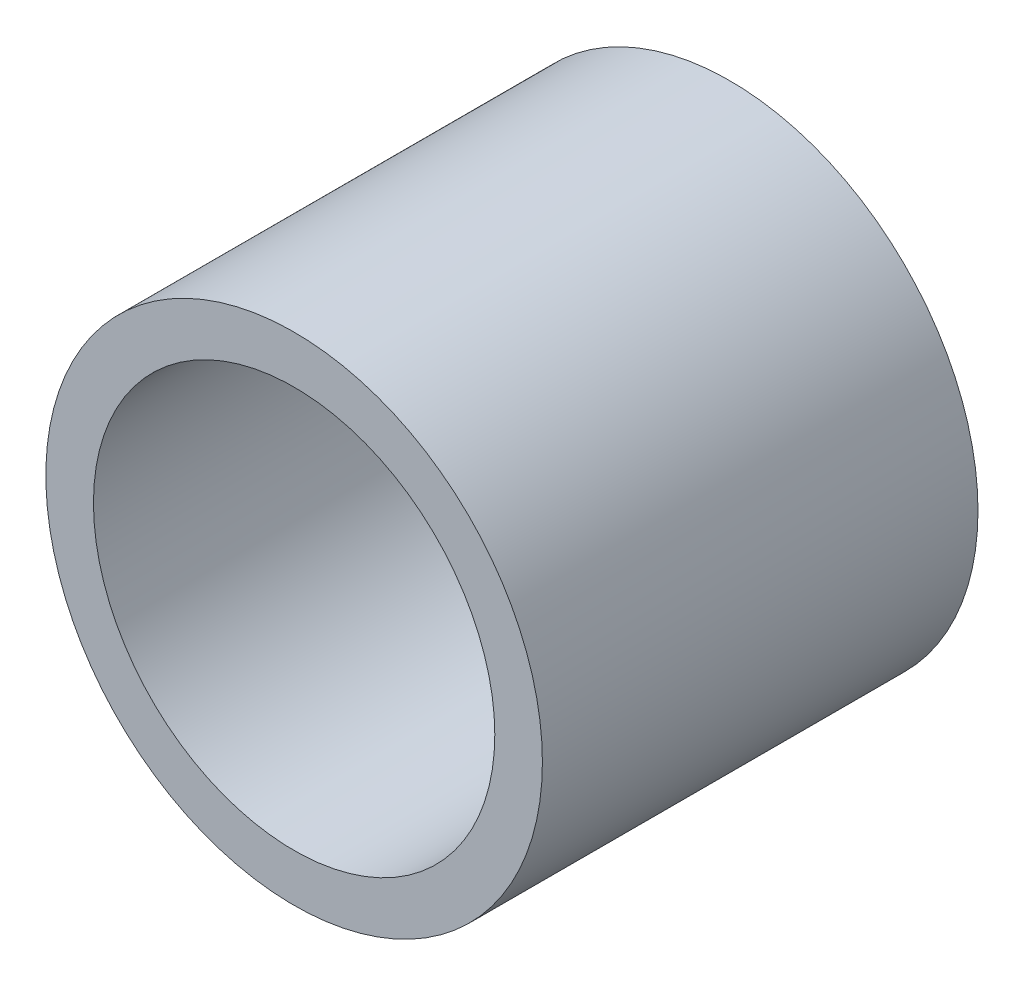
ISO-10303-21;
HEADER;
FILE_DESCRIPTION(('STEP AP214'),'2;1');
FILE_NAME('part.step','',(''),(''),'','','');
FILE_SCHEMA(('AUTOMOTIVE_DESIGN { 1 0 10303 214 1 1 1 1 }'));
ENDSEC;
DATA;
#1=APPLICATION_CONTEXT('core data for automotive mechanical design processes');
#2=APPLICATION_PROTOCOL_DEFINITION('international standard','automotive_design',2000,#1);
#3=PRODUCT_CONTEXT('',#1,'mechanical');
#4=PRODUCT('Part','Part','',(#3));
#5=PRODUCT_RELATED_PRODUCT_CATEGORY('part','',(#4));
#6=PRODUCT_DEFINITION_FORMATION('','',#4);
#7=PRODUCT_DEFINITION_CONTEXT('part definition',#1,'design');
#8=PRODUCT_DEFINITION('design','',#6,#7);
#9=PRODUCT_DEFINITION_SHAPE('','',#8);
#10=(LENGTH_UNIT() NAMED_UNIT(*) SI_UNIT(.MILLI.,.METRE.));
#11=(NAMED_UNIT(*) PLANE_ANGLE_UNIT() SI_UNIT($,.RADIAN.));
#12=(NAMED_UNIT(*) SI_UNIT($,.STERADIAN.) SOLID_ANGLE_UNIT());
#13=UNCERTAINTY_MEASURE_WITH_UNIT(LENGTH_MEASURE(1.E-05),#10,'distance_accuracy_value','');
#14=(GEOMETRIC_REPRESENTATION_CONTEXT(3) GLOBAL_UNCERTAINTY_ASSIGNED_CONTEXT((#13)) GLOBAL_UNIT_ASSIGNED_CONTEXT((#10,
#11,#12)) REPRESENTATION_CONTEXT('',''));
#15=CARTESIAN_POINT('',(0.,0.,0.));
#16=DIRECTION('',(0.,0.,1.));
#17=DIRECTION('',(1.,0.,0.));
#18=AXIS2_PLACEMENT_3D('',#15,#16,#17);
#19=CARTESIAN_POINT('',(0.,0.,7.));
#20=DIRECTION('',(0.,0.,1.));
#21=DIRECTION('',(1.,0.,0.));
#22=AXIS2_PLACEMENT_3D('',#19,#20,#21);
#23=PLANE('',#22);
#24=CARTESIAN_POINT('',(0.,0.,7.));
#25=DIRECTION('',(0.,0.,1.));
#26=DIRECTION('',(1.,0.,0.));
#27=AXIS2_PLACEMENT_3D('',#24,#25,#26);
#28=CIRCLE('',#27,3.99);
#29=CARTESIAN_POINT('',(3.99,0.,7.));
#30=VERTEX_POINT('',#29);
#31=EDGE_CURVE('E10',#30,#30,#28,.T.);
#32=ORIENTED_EDGE('',*,*,#31,.T.);
#33=EDGE_LOOP('',(#32));
#34=FACE_BOUND('',#33,.T.);
#35=CARTESIAN_POINT('',(0.,0.,7.));
#36=DIRECTION('',(0.,0.,1.));
#37=DIRECTION('',(1.,0.,0.));
#38=AXIS2_PLACEMENT_3D('',#35,#36,#37);
#39=CIRCLE('',#38,3.225);
#40=CARTESIAN_POINT('',(3.225,0.,7.));
#41=VERTEX_POINT('',#40);
#42=EDGE_CURVE('E55',#41,#41,#39,.T.);
#43=ORIENTED_EDGE('',*,*,#42,.F.);
#44=EDGE_LOOP('',(#43));
#45=FACE_BOUND('',#44,.T.);
#46=ADVANCED_FACE('F41',(#34,#45),#23,.T.);
#47=CARTESIAN_POINT('',(0.,0.,0.));
#48=DIRECTION('',(0.,0.,1.));
#49=DIRECTION('',(1.,0.,0.));
#50=AXIS2_PLACEMENT_3D('',#47,#48,#49);
#51=PLANE('',#50);
#52=CARTESIAN_POINT('',(0.,0.,0.));
#53=DIRECTION('',(0.,0.,1.));
#54=DIRECTION('',(1.,0.,0.));
#55=AXIS2_PLACEMENT_3D('',#52,#53,#54);
#56=CIRCLE('',#55,3.99);
#57=CARTESIAN_POINT('',(3.99,0.,0.));
#58=VERTEX_POINT('',#57);
#59=EDGE_CURVE('E44',#58,#58,#56,.T.);
#60=ORIENTED_EDGE('',*,*,#59,.F.);
#61=EDGE_LOOP('',(#60));
#62=FACE_BOUND('',#61,.T.);
#63=CARTESIAN_POINT('',(0.,0.,0.));
#64=DIRECTION('',(0.,0.,1.));
#65=DIRECTION('',(1.,0.,0.));
#66=AXIS2_PLACEMENT_3D('',#63,#64,#65);
#67=CIRCLE('',#66,3.225);
#68=CARTESIAN_POINT('',(3.225,0.,0.));
#69=VERTEX_POINT('',#68);
#70=EDGE_CURVE('E53',#69,#69,#67,.T.);
#71=ORIENTED_EDGE('',*,*,#70,.T.);
#72=EDGE_LOOP('',(#71));
#73=FACE_BOUND('',#72,.T.);
#74=ADVANCED_FACE('F62',(#62,#73),#51,.F.);
#75=CARTESIAN_POINT('',(0.,0.,7.));
#76=DIRECTION('',(0.,0.,-1.));
#77=DIRECTION('',(-1.,0.,0.));
#78=AXIS2_PLACEMENT_3D('',#75,#76,#77);
#79=CYLINDRICAL_SURFACE('',#78,3.99);
#80=ORIENTED_EDGE('',*,*,#31,.F.);
#81=EDGE_LOOP('',(#80));
#82=FACE_BOUND('',#81,.T.);
#83=ORIENTED_EDGE('',*,*,#59,.T.);
#84=EDGE_LOOP('',(#83));
#85=FACE_BOUND('',#84,.T.);
#86=ADVANCED_FACE('F43',(#82,#85),#79,.T.);
#87=CARTESIAN_POINT('',(0.,0.,7.));
#88=DIRECTION('',(0.,0.,-1.));
#89=DIRECTION('',(-1.,0.,0.));
#90=AXIS2_PLACEMENT_3D('',#87,#88,#89);
#91=CYLINDRICAL_SURFACE('',#90,3.225);
#92=ORIENTED_EDGE('',*,*,#42,.T.);
#93=EDGE_LOOP('',(#92));
#94=FACE_BOUND('',#93,.T.);
#95=ORIENTED_EDGE('',*,*,#70,.F.);
#96=EDGE_LOOP('',(#95));
#97=FACE_BOUND('',#96,.T.);
#98=ADVANCED_FACE('F58',(#94,#97),#91,.F.);
#99=CLOSED_SHELL('',(#46,#74,#86,#98));
#100=MANIFOLD_SOLID_BREP('B2',#99);
#101=ADVANCED_BREP_SHAPE_REPRESENTATION('',(#18,#100),#14);
#102=SHAPE_DEFINITION_REPRESENTATION(#9,#101);
ENDSEC;
END-ISO-10303-21;
